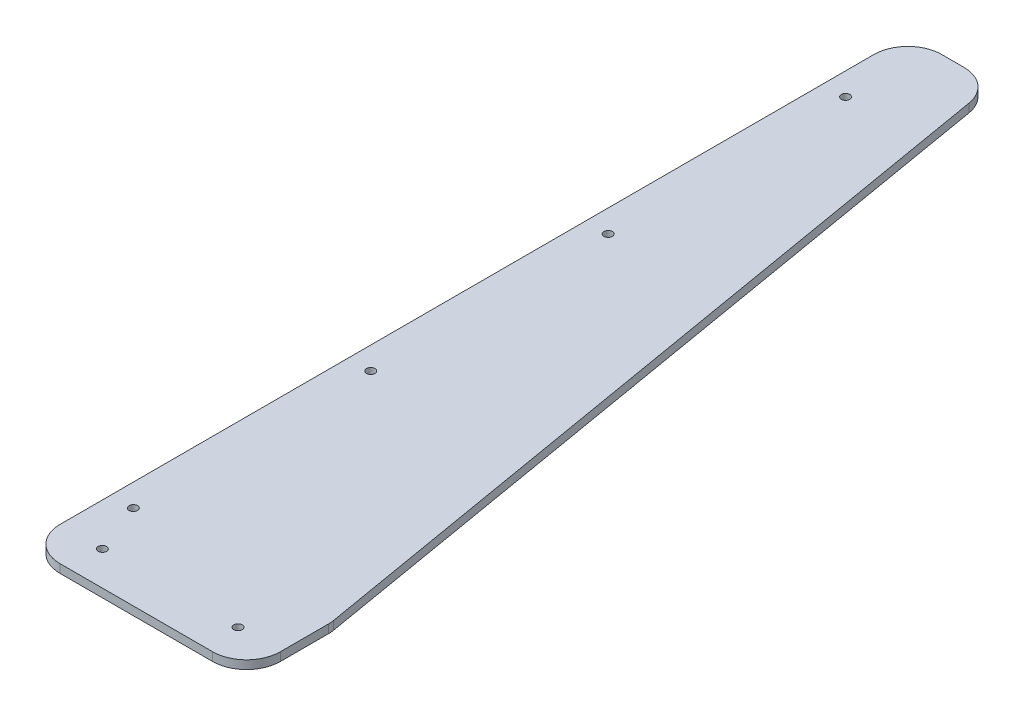
ISO-10303-21;
HEADER;
FILE_DESCRIPTION(('STEP AP214'),'2;1');
FILE_NAME('part.step','',(''),(''),'','','');
FILE_SCHEMA(('AUTOMOTIVE_DESIGN { 1 0 10303 214 1 1 1 1 }'));
ENDSEC;
DATA;
#1=APPLICATION_CONTEXT('core data for automotive mechanical design processes');
#2=APPLICATION_PROTOCOL_DEFINITION('international standard','automotive_design',2000,#1);
#3=PRODUCT_CONTEXT('',#1,'mechanical');
#4=PRODUCT('Part','Part','',(#3));
#5=PRODUCT_RELATED_PRODUCT_CATEGORY('part','',(#4));
#6=PRODUCT_DEFINITION_FORMATION('','',#4);
#7=PRODUCT_DEFINITION_CONTEXT('part definition',#1,'design');
#8=PRODUCT_DEFINITION('design','',#6,#7);
#9=PRODUCT_DEFINITION_SHAPE('','',#8);
#10=(LENGTH_UNIT() NAMED_UNIT(*) SI_UNIT(.MILLI.,.METRE.));
#11=(NAMED_UNIT(*) PLANE_ANGLE_UNIT() SI_UNIT($,.RADIAN.));
#12=(NAMED_UNIT(*) SI_UNIT($,.STERADIAN.) SOLID_ANGLE_UNIT());
#13=UNCERTAINTY_MEASURE_WITH_UNIT(LENGTH_MEASURE(1.E-05),#10,'distance_accuracy_value','');
#14=(GEOMETRIC_REPRESENTATION_CONTEXT(3) GLOBAL_UNCERTAINTY_ASSIGNED_CONTEXT((#13)) GLOBAL_UNIT_ASSIGNED_CONTEXT((#10,
#11,#12)) REPRESENTATION_CONTEXT('',''));
#15=CARTESIAN_POINT('',(0.,0.,0.));
#16=DIRECTION('',(0.,0.,1.));
#17=DIRECTION('',(1.,0.,0.));
#18=AXIS2_PLACEMENT_3D('',#15,#16,#17);
#19=CARTESIAN_POINT('',(0.,3.175,0.));
#20=DIRECTION('',(1.,0.,0.));
#21=DIRECTION('',(0.,0.,-1.));
#22=AXIS2_PLACEMENT_3D('',#19,#20,#21);
#23=PLANE('',#22);
#24=DIRECTION('',(0.,0.,1.));
#25=VECTOR('',#24,1.);
#26=CARTESIAN_POINT('',(0.,0.,0.));
#27=LINE('',#26,#25);
#28=CARTESIAN_POINT('',(0.,0.,-317.5));
#29=VERTEX_POINT('',#28);
#30=CARTESIAN_POINT('',(0.,0.,-12.7));
#31=VERTEX_POINT('',#30);
#32=EDGE_CURVE('E137',#29,#31,#27,.T.);
#33=ORIENTED_EDGE('',*,*,#32,.T.);
#34=DIRECTION('',(0.,-1.,0.));
#35=VECTOR('',#34,1.);
#36=CARTESIAN_POINT('',(0.,3.175,-12.7));
#37=LINE('',#36,#35);
#38=CARTESIAN_POINT('',(0.,3.175,-12.7));
#39=VERTEX_POINT('',#38);
#40=EDGE_CURVE('E115',#31,#39,#37,.F.);
#41=ORIENTED_EDGE('',*,*,#40,.T.);
#42=DIRECTION('',(0.,0.,1.));
#43=VECTOR('',#42,1.);
#44=CARTESIAN_POINT('',(0.,3.175,0.));
#45=LINE('',#44,#43);
#46=CARTESIAN_POINT('',(0.,3.175,-317.5));
#47=VERTEX_POINT('',#46);
#48=EDGE_CURVE('E150',#47,#39,#45,.T.);
#49=ORIENTED_EDGE('',*,*,#48,.F.);
#50=DIRECTION('',(0.,-1.,0.));
#51=VECTOR('',#50,1.);
#52=CARTESIAN_POINT('',(0.,3.175,-317.5));
#53=LINE('',#52,#51);
#54=EDGE_CURVE('E120',#47,#29,#53,.T.);
#55=ORIENTED_EDGE('',*,*,#54,.T.);
#56=EDGE_LOOP('',(#33,#41,#49,#55));
#57=FACE_BOUND('',#56,.T.);
#58=ADVANCED_FACE('F33',(#57),#23,.F.);
#59=CARTESIAN_POINT('',(31.75,3.175,0.));
#60=DIRECTION('',(0.,0.,-1.));
#61=DIRECTION('',(-1.,0.,0.));
#62=AXIS2_PLACEMENT_3D('',#59,#60,#61);
#63=PLANE('',#62);
#64=DIRECTION('',(1.,0.,0.));
#65=VECTOR('',#64,1.);
#66=CARTESIAN_POINT('',(0.,3.175,0.));
#67=LINE('',#66,#65);
#68=CARTESIAN_POINT('',(12.7,3.175,0.));
#69=VERTEX_POINT('',#68);
#70=CARTESIAN_POINT('',(69.85,3.175,0.));
#71=VERTEX_POINT('',#70);
#72=EDGE_CURVE('E130',#69,#71,#67,.T.);
#73=ORIENTED_EDGE('',*,*,#72,.F.);
#74=DIRECTION('',(0.,-1.,0.));
#75=VECTOR('',#74,1.);
#76=CARTESIAN_POINT('',(12.7,3.175,0.));
#77=LINE('',#76,#75);
#78=CARTESIAN_POINT('',(12.7,0.,0.));
#79=VERTEX_POINT('',#78);
#80=EDGE_CURVE('E114',#69,#79,#77,.T.);
#81=ORIENTED_EDGE('',*,*,#80,.T.);
#82=DIRECTION('',(1.,0.,0.));
#83=VECTOR('',#82,1.);
#84=CARTESIAN_POINT('',(31.75,0.,0.));
#85=LINE('',#84,#83);
#86=CARTESIAN_POINT('',(69.85,0.,0.));
#87=VERTEX_POINT('',#86);
#88=EDGE_CURVE('E127',#79,#87,#85,.T.);
#89=ORIENTED_EDGE('',*,*,#88,.T.);
#90=DIRECTION('',(0.,-1.,0.));
#91=VECTOR('',#90,1.);
#92=CARTESIAN_POINT('',(69.85,3.175,0.));
#93=LINE('',#92,#91);
#94=EDGE_CURVE('E132',#87,#71,#93,.F.);
#95=ORIENTED_EDGE('',*,*,#94,.T.);
#96=EDGE_LOOP('',(#73,#81,#89,#95));
#97=FACE_BOUND('',#96,.T.);
#98=ADVANCED_FACE('F126',(#97),#63,.F.);
#99=CARTESIAN_POINT('',(82.55,3.175,0.));
#100=DIRECTION('',(-1.,0.,0.));
#101=DIRECTION('',(0.,0.,1.));
#102=AXIS2_PLACEMENT_3D('',#99,#100,#101);
#103=PLANE('',#102);
#104=DIRECTION('',(0.,0.,-1.));
#105=VECTOR('',#104,1.);
#106=CARTESIAN_POINT('',(82.55,3.175,0.));
#107=LINE('',#106,#105);
#108=CARTESIAN_POINT('',(82.55,3.175,-12.7));
#109=VERTEX_POINT('',#108);
#110=CARTESIAN_POINT('',(82.55,3.175,-30.6768662492677));
#111=VERTEX_POINT('',#110);
#112=EDGE_CURVE('E194',#109,#111,#107,.T.);
#113=ORIENTED_EDGE('',*,*,#112,.F.);
#114=DIRECTION('',(0.,-1.,0.));
#115=VECTOR('',#114,1.);
#116=CARTESIAN_POINT('',(82.55,3.175,-12.7));
#117=LINE('',#116,#115);
#118=CARTESIAN_POINT('',(82.55,0.,-12.7));
#119=VERTEX_POINT('',#118);
#120=EDGE_CURVE('E173',#109,#119,#117,.T.);
#121=ORIENTED_EDGE('',*,*,#120,.T.);
#122=DIRECTION('',(0.,0.,-1.));
#123=VECTOR('',#122,1.);
#124=CARTESIAN_POINT('',(82.55,0.,0.));
#125=LINE('',#124,#123);
#126=CARTESIAN_POINT('',(82.55,0.,-30.6768662492677));
#127=VERTEX_POINT('',#126);
#128=EDGE_CURVE('E136',#119,#127,#125,.T.);
#129=ORIENTED_EDGE('',*,*,#128,.T.);
#130=DIRECTION('',(0.,-1.,0.));
#131=VECTOR('',#130,1.);
#132=CARTESIAN_POINT('',(82.55,3.175,-30.6768662492677));
#133=LINE('',#132,#131);
#134=EDGE_CURVE('E171',#127,#111,#133,.F.);
#135=ORIENTED_EDGE('',*,*,#134,.T.);
#136=EDGE_LOOP('',(#113,#121,#129,#135));
#137=FACE_BOUND('',#136,.T.);
#138=ADVANCED_FACE('F222',(#137),#103,.F.);
#139=CARTESIAN_POINT('',(31.75,3.175,-330.2));
#140=DIRECTION('',(-0.985821169784127,0.,0.167799348048362));
#141=DIRECTION('',(0.167799348048362,0.,0.985821169784127));
#142=AXIS2_PLACEMENT_3D('',#139,#140,#141);
#143=PLANE('',#142);
#144=DIRECTION('',(-0.167799348048362,0.,-0.985821169784127));
#145=VECTOR('',#144,1.);
#146=CARTESIAN_POINT('',(31.75,3.175,-330.2));
#147=LINE('',#146,#145);
#148=CARTESIAN_POINT('',(82.3699288562584,3.175,-32.8079179694818));
#149=VERTEX_POINT('',#148);
#150=CARTESIAN_POINT('',(33.5489699199635,3.175,-319.631051720214));
#151=VERTEX_POINT('',#150);
#152=EDGE_CURVE('E201',#149,#151,#147,.T.);
#153=ORIENTED_EDGE('',*,*,#152,.F.);
#154=DIRECTION('',(0.,-1.,0.));
#155=VECTOR('',#154,1.);
#156=CARTESIAN_POINT('',(82.3699288562584,3.175,-32.807917969482));
#157=LINE('',#156,#155);
#158=CARTESIAN_POINT('',(82.3699288562584,0.,-32.8079179694818));
#159=VERTEX_POINT('',#158);
#160=EDGE_CURVE('E178',#149,#159,#157,.T.);
#161=ORIENTED_EDGE('',*,*,#160,.T.);
#162=DIRECTION('',(-0.167799348048362,0.,-0.985821169784127));
#163=VECTOR('',#162,1.);
#164=CARTESIAN_POINT('',(31.75,0.,-330.2));
#165=LINE('',#164,#163);
#166=CARTESIAN_POINT('',(33.5489699199635,0.,-319.631051720214));
#167=VERTEX_POINT('',#166);
#168=EDGE_CURVE('E140',#159,#167,#165,.T.);
#169=ORIENTED_EDGE('',*,*,#168,.T.);
#170=DIRECTION('',(0.,-1.,0.));
#171=VECTOR('',#170,1.);
#172=CARTESIAN_POINT('',(33.5489699199635,3.175,-319.631051720214));
#173=LINE('',#172,#171);
#174=EDGE_CURVE('E176',#167,#151,#173,.F.);
#175=ORIENTED_EDGE('',*,*,#174,.T.);
#176=EDGE_LOOP('',(#153,#161,#169,#175));
#177=FACE_BOUND('',#176,.T.);
#178=ADVANCED_FACE('F212',(#177),#143,.F.);
#179=CARTESIAN_POINT('',(0.,3.175,-330.2));
#180=DIRECTION('',(0.,0.,1.));
#181=DIRECTION('',(1.,0.,0.));
#182=AXIS2_PLACEMENT_3D('',#179,#180,#181);
#183=PLANE('',#182);
#184=DIRECTION('',(-1.,0.,0.));
#185=VECTOR('',#184,1.);
#186=CARTESIAN_POINT('',(0.,0.,-330.2));
#187=LINE('',#186,#185);
#188=CARTESIAN_POINT('',(21.0290410637051,0.,-330.2));
#189=VERTEX_POINT('',#188);
#190=CARTESIAN_POINT('',(12.7,0.,-330.2));
#191=VERTEX_POINT('',#190);
#192=EDGE_CURVE('E148',#189,#191,#187,.T.);
#193=ORIENTED_EDGE('',*,*,#192,.T.);
#194=DIRECTION('',(0.,-1.,0.));
#195=VECTOR('',#194,1.);
#196=CARTESIAN_POINT('',(12.7,3.175,-330.2));
#197=LINE('',#196,#195);
#198=CARTESIAN_POINT('',(12.7,3.175,-330.2));
#199=VERTEX_POINT('',#198);
#200=EDGE_CURVE('E11',#191,#199,#197,.F.);
#201=ORIENTED_EDGE('',*,*,#200,.T.);
#202=DIRECTION('',(-1.,0.,0.));
#203=VECTOR('',#202,1.);
#204=CARTESIAN_POINT('',(0.,3.175,-330.2));
#205=LINE('',#204,#203);
#206=CARTESIAN_POINT('',(21.0290410637051,3.175,-330.2));
#207=VERTEX_POINT('',#206);
#208=EDGE_CURVE('E151',#207,#199,#205,.T.);
#209=ORIENTED_EDGE('',*,*,#208,.F.);
#210=DIRECTION('',(0.,-1.,0.));
#211=VECTOR('',#210,1.);
#212=CARTESIAN_POINT('',(21.0290410637051,3.175,-330.2));
#213=LINE('',#212,#211);
#214=EDGE_CURVE('E41',#207,#189,#213,.T.);
#215=ORIENTED_EDGE('',*,*,#214,.T.);
#216=EDGE_LOOP('',(#193,#201,#209,#215));
#217=FACE_BOUND('',#216,.T.);
#218=ADVANCED_FACE('F183',(#217),#183,.F.);
#219=CARTESIAN_POINT('',(0.,3.175,0.));
#220=DIRECTION('',(0.,-1.,0.));
#221=DIRECTION('',(0.,0.,-1.));
#222=AXIS2_PLACEMENT_3D('',#219,#220,#221);
#223=PLANE('',#222);
#224=CARTESIAN_POINT('',(8.43279999999994,3.175,-298.45));
#225=DIRECTION('',(0.,-1.,0.));
#226=DIRECTION('',(0.,0.,-1.));
#227=AXIS2_PLACEMENT_3D('',#224,#225,#226);
#228=CIRCLE('',#227,1.5875);
#229=CARTESIAN_POINT('',(8.43279999999994,3.175,-300.0375));
#230=VERTEX_POINT('',#229);
#231=EDGE_CURVE('E363',#230,#230,#228,.T.);
#232=ORIENTED_EDGE('',*,*,#231,.T.);
#233=EDGE_LOOP('',(#232));
#234=FACE_BOUND('',#233,.T.);
#235=CARTESIAN_POINT('',(8.43279999999994,3.175,-209.55));
#236=DIRECTION('',(0.,-1.,0.));
#237=DIRECTION('',(0.,0.,-1.));
#238=AXIS2_PLACEMENT_3D('',#235,#236,#237);
#239=CIRCLE('',#238,1.5875);
#240=CARTESIAN_POINT('',(8.43279999999994,3.175,-211.1375));
#241=VERTEX_POINT('',#240);
#242=EDGE_CURVE('E373',#241,#241,#239,.T.);
#243=ORIENTED_EDGE('',*,*,#242,.T.);
#244=EDGE_LOOP('',(#243));
#245=FACE_BOUND('',#244,.T.);
#246=CARTESIAN_POINT('',(8.43279999999994,3.175,-120.65));
#247=DIRECTION('',(0.,-1.,0.));
#248=DIRECTION('',(0.,0.,-1.));
#249=AXIS2_PLACEMENT_3D('',#246,#247,#248);
#250=CIRCLE('',#249,1.5875);
#251=CARTESIAN_POINT('',(8.43279999999994,3.175,-122.2375));
#252=VERTEX_POINT('',#251);
#253=EDGE_CURVE('E379',#252,#252,#250,.T.);
#254=ORIENTED_EDGE('',*,*,#253,.T.);
#255=EDGE_LOOP('',(#254));
#256=FACE_BOUND('',#255,.T.);
#257=CARTESIAN_POINT('',(8.43279999999998,3.175,-31.75));
#258=DIRECTION('',(0.,-1.,0.));
#259=DIRECTION('',(0.,0.,-1.));
#260=AXIS2_PLACEMENT_3D('',#257,#258,#259);
#261=CIRCLE('',#260,1.5875);
#262=CARTESIAN_POINT('',(8.43279999999998,3.175,-33.3375));
#263=VERTEX_POINT('',#262);
#264=EDGE_CURVE('E385',#263,#263,#261,.T.);
#265=ORIENTED_EDGE('',*,*,#264,.T.);
#266=EDGE_LOOP('',(#265));
#267=FACE_BOUND('',#266,.T.);
#268=CARTESIAN_POINT('',(66.675,3.175,-12.7));
#269=DIRECTION('',(0.,-1.,0.));
#270=DIRECTION('',(0.,0.,-1.));
#271=AXIS2_PLACEMENT_3D('',#268,#269,#270);
#272=CIRCLE('',#271,1.58749999999999);
#273=CARTESIAN_POINT('',(66.675,3.175,-14.2875));
#274=VERTEX_POINT('',#273);
#275=EDGE_CURVE('E391',#274,#274,#272,.T.);
#276=ORIENTED_EDGE('',*,*,#275,.T.);
#277=EDGE_LOOP('',(#276));
#278=FACE_BOUND('',#277,.T.);
#279=CARTESIAN_POINT('',(15.875,3.175,-12.7));
#280=DIRECTION('',(0.,-1.,0.));
#281=DIRECTION('',(0.,0.,-1.));
#282=AXIS2_PLACEMENT_3D('',#279,#280,#281);
#283=CIRCLE('',#282,1.5875);
#284=CARTESIAN_POINT('',(15.875,3.175,-14.2875));
#285=VERTEX_POINT('',#284);
#286=EDGE_CURVE('E142',#285,#285,#283,.T.);
#287=ORIENTED_EDGE('',*,*,#286,.T.);
#288=EDGE_LOOP('',(#287));
#289=FACE_BOUND('',#288,.T.);
#290=ORIENTED_EDGE('',*,*,#48,.T.);
#291=CARTESIAN_POINT('',(12.7,3.175,-12.7));
#292=DIRECTION('',(0.,-1.,0.));
#293=DIRECTION('',(0.,0.,-1.));
#294=AXIS2_PLACEMENT_3D('',#291,#292,#293);
#295=CIRCLE('',#294,12.7);
#296=EDGE_CURVE('E169',#39,#69,#295,.F.);
#297=ORIENTED_EDGE('',*,*,#296,.T.);
#298=ORIENTED_EDGE('',*,*,#72,.T.);
#299=CARTESIAN_POINT('',(69.85,3.175,-12.7));
#300=DIRECTION('',(0.,-1.,0.));
#301=DIRECTION('',(0.,0.,-1.));
#302=AXIS2_PLACEMENT_3D('',#299,#300,#301);
#303=CIRCLE('',#302,12.7);
#304=EDGE_CURVE('E167',#71,#109,#303,.F.);
#305=ORIENTED_EDGE('',*,*,#304,.T.);
#306=ORIENTED_EDGE('',*,*,#112,.T.);
#307=CARTESIAN_POINT('',(69.85,3.175,-30.6768662492677));
#308=DIRECTION('',(0.,-1.,0.));
#309=DIRECTION('',(0.,0.,-1.));
#310=AXIS2_PLACEMENT_3D('',#307,#308,#309);
#311=CIRCLE('',#310,12.7);
#312=EDGE_CURVE('E165',#111,#149,#311,.F.);
#313=ORIENTED_EDGE('',*,*,#312,.T.);
#314=ORIENTED_EDGE('',*,*,#152,.T.);
#315=CARTESIAN_POINT('',(21.0290410637051,3.175,-317.5));
#316=DIRECTION('',(0.,-1.,0.));
#317=DIRECTION('',(0.,0.,-1.));
#318=AXIS2_PLACEMENT_3D('',#315,#316,#317);
#319=CIRCLE('',#318,12.7);
#320=EDGE_CURVE('E53',#151,#207,#319,.F.);
#321=ORIENTED_EDGE('',*,*,#320,.T.);
#322=ORIENTED_EDGE('',*,*,#208,.T.);
#323=CARTESIAN_POINT('',(12.7,3.175,-317.5));
#324=DIRECTION('',(0.,-1.,0.));
#325=DIRECTION('',(0.,0.,-1.));
#326=AXIS2_PLACEMENT_3D('',#323,#324,#325);
#327=CIRCLE('',#326,12.7);
#328=EDGE_CURVE('E163',#199,#47,#327,.F.);
#329=ORIENTED_EDGE('',*,*,#328,.T.);
#330=EDGE_LOOP('',(#290,#297,#298,#305,#306,#313,#314,#321,#322,#329));
#331=FACE_BOUND('',#330,.T.);
#332=ADVANCED_FACE('F202',(#234,#245,#256,#267,#278,#289,#331),#223,.F.);
#333=CARTESIAN_POINT('',(0.,0.,0.));
#334=DIRECTION('',(0.,-1.,0.));
#335=DIRECTION('',(0.,0.,-1.));
#336=AXIS2_PLACEMENT_3D('',#333,#334,#335);
#337=PLANE('',#336);
#338=CARTESIAN_POINT('',(8.43279999999994,0.,-298.45));
#339=DIRECTION('',(0.,-1.,0.));
#340=DIRECTION('',(0.,0.,-1.));
#341=AXIS2_PLACEMENT_3D('',#338,#339,#340);
#342=CIRCLE('',#341,1.58749999999999);
#343=CARTESIAN_POINT('',(8.43279999999994,0.,-300.0375));
#344=VERTEX_POINT('',#343);
#345=EDGE_CURVE('E366',#344,#344,#342,.T.);
#346=ORIENTED_EDGE('',*,*,#345,.F.);
#347=EDGE_LOOP('',(#346));
#348=FACE_BOUND('',#347,.T.);
#349=CARTESIAN_POINT('',(8.43279999999994,0.,-209.55));
#350=DIRECTION('',(0.,-1.,0.));
#351=DIRECTION('',(0.,0.,-1.));
#352=AXIS2_PLACEMENT_3D('',#349,#350,#351);
#353=CIRCLE('',#352,1.58749999999999);
#354=CARTESIAN_POINT('',(8.43279999999994,0.,-211.1375));
#355=VERTEX_POINT('',#354);
#356=EDGE_CURVE('E368',#355,#355,#353,.T.);
#357=ORIENTED_EDGE('',*,*,#356,.F.);
#358=EDGE_LOOP('',(#357));
#359=FACE_BOUND('',#358,.T.);
#360=CARTESIAN_POINT('',(8.43279999999994,0.,-120.65));
#361=DIRECTION('',(0.,-1.,0.));
#362=DIRECTION('',(0.,0.,-1.));
#363=AXIS2_PLACEMENT_3D('',#360,#361,#362);
#364=CIRCLE('',#363,1.58749999999999);
#365=CARTESIAN_POINT('',(8.43279999999994,0.,-122.2375));
#366=VERTEX_POINT('',#365);
#367=EDGE_CURVE('E376',#366,#366,#364,.T.);
#368=ORIENTED_EDGE('',*,*,#367,.F.);
#369=EDGE_LOOP('',(#368));
#370=FACE_BOUND('',#369,.T.);
#371=CARTESIAN_POINT('',(8.43279999999998,0.,-31.75));
#372=DIRECTION('',(0.,-1.,0.));
#373=DIRECTION('',(0.,0.,-1.));
#374=AXIS2_PLACEMENT_3D('',#371,#372,#373);
#375=CIRCLE('',#374,1.58749999999999);
#376=CARTESIAN_POINT('',(8.43279999999998,0.,-33.3375));
#377=VERTEX_POINT('',#376);
#378=EDGE_CURVE('E382',#377,#377,#375,.T.);
#379=ORIENTED_EDGE('',*,*,#378,.F.);
#380=EDGE_LOOP('',(#379));
#381=FACE_BOUND('',#380,.T.);
#382=CARTESIAN_POINT('',(66.675,0.,-12.7));
#383=DIRECTION('',(0.,-1.,0.));
#384=DIRECTION('',(0.,0.,-1.));
#385=AXIS2_PLACEMENT_3D('',#382,#383,#384);
#386=CIRCLE('',#385,1.58749999999999);
#387=CARTESIAN_POINT('',(66.675,0.,-14.2875));
#388=VERTEX_POINT('',#387);
#389=EDGE_CURVE('E388',#388,#388,#386,.T.);
#390=ORIENTED_EDGE('',*,*,#389,.F.);
#391=EDGE_LOOP('',(#390));
#392=FACE_BOUND('',#391,.T.);
#393=CARTESIAN_POINT('',(15.875,0.,-12.7));
#394=DIRECTION('',(0.,-1.,0.));
#395=DIRECTION('',(0.,0.,-1.));
#396=AXIS2_PLACEMENT_3D('',#393,#394,#395);
#397=CIRCLE('',#396,1.58749999999999);
#398=CARTESIAN_POINT('',(15.875,0.,-14.2875));
#399=VERTEX_POINT('',#398);
#400=EDGE_CURVE('E393',#399,#399,#397,.T.);
#401=ORIENTED_EDGE('',*,*,#400,.F.);
#402=EDGE_LOOP('',(#401));
#403=FACE_BOUND('',#402,.T.);
#404=ORIENTED_EDGE('',*,*,#88,.F.);
#405=CARTESIAN_POINT('',(12.7,0.,-12.7));
#406=DIRECTION('',(0.,-1.,0.));
#407=DIRECTION('',(0.,0.,-1.));
#408=AXIS2_PLACEMENT_3D('',#405,#406,#407);
#409=CIRCLE('',#408,12.7);
#410=EDGE_CURVE('E110',#79,#31,#409,.T.);
#411=ORIENTED_EDGE('',*,*,#410,.T.);
#412=ORIENTED_EDGE('',*,*,#32,.F.);
#413=CARTESIAN_POINT('',(12.7,0.,-317.5));
#414=DIRECTION('',(0.,-1.,0.));
#415=DIRECTION('',(0.,0.,-1.));
#416=AXIS2_PLACEMENT_3D('',#413,#414,#415);
#417=CIRCLE('',#416,12.7);
#418=EDGE_CURVE('E154',#29,#191,#417,.T.);
#419=ORIENTED_EDGE('',*,*,#418,.T.);
#420=ORIENTED_EDGE('',*,*,#192,.F.);
#421=CARTESIAN_POINT('',(21.0290410637051,0.,-317.5));
#422=DIRECTION('',(0.,-1.,0.));
#423=DIRECTION('',(0.,0.,-1.));
#424=AXIS2_PLACEMENT_3D('',#421,#422,#423);
#425=CIRCLE('',#424,12.7);
#426=EDGE_CURVE('E131',#189,#167,#425,.T.);
#427=ORIENTED_EDGE('',*,*,#426,.T.);
#428=ORIENTED_EDGE('',*,*,#168,.F.);
#429=CARTESIAN_POINT('',(69.85,0.,-30.6768662492677));
#430=DIRECTION('',(0.,-1.,0.));
#431=DIRECTION('',(0.,0.,-1.));
#432=AXIS2_PLACEMENT_3D('',#429,#430,#431);
#433=CIRCLE('',#432,12.7);
#434=EDGE_CURVE('E156',#159,#127,#433,.T.);
#435=ORIENTED_EDGE('',*,*,#434,.T.);
#436=ORIENTED_EDGE('',*,*,#128,.F.);
#437=CARTESIAN_POINT('',(69.85,0.,-12.7));
#438=DIRECTION('',(0.,-1.,0.));
#439=DIRECTION('',(0.,0.,-1.));
#440=AXIS2_PLACEMENT_3D('',#437,#438,#439);
#441=CIRCLE('',#440,12.7);
#442=EDGE_CURVE('E121',#119,#87,#441,.T.);
#443=ORIENTED_EDGE('',*,*,#442,.T.);
#444=EDGE_LOOP('',(#404,#411,#412,#419,#420,#427,#428,#435,#436,#443));
#445=FACE_BOUND('',#444,.T.);
#446=ADVANCED_FACE('F134',(#348,#359,#370,#381,#392,#403,#445),#337,.T.);
#447=CARTESIAN_POINT('',(12.7,3.175,-12.7));
#448=DIRECTION('',(0.,-1.,0.));
#449=DIRECTION('',(0.,0.,-1.));
#450=AXIS2_PLACEMENT_3D('',#447,#448,#449);
#451=CYLINDRICAL_SURFACE('',#450,12.7);
#452=ORIENTED_EDGE('',*,*,#296,.F.);
#453=ORIENTED_EDGE('',*,*,#40,.F.);
#454=ORIENTED_EDGE('',*,*,#410,.F.);
#455=ORIENTED_EDGE('',*,*,#80,.F.);
#456=EDGE_LOOP('',(#452,#453,#454,#455));
#457=FACE_BOUND('',#456,.T.);
#458=ADVANCED_FACE('F113',(#457),#451,.T.);
#459=CARTESIAN_POINT('',(69.85,3.175,-12.7));
#460=DIRECTION('',(0.,-1.,0.));
#461=DIRECTION('',(0.,0.,-1.));
#462=AXIS2_PLACEMENT_3D('',#459,#460,#461);
#463=CYLINDRICAL_SURFACE('',#462,12.7);
#464=ORIENTED_EDGE('',*,*,#304,.F.);
#465=ORIENTED_EDGE('',*,*,#94,.F.);
#466=ORIENTED_EDGE('',*,*,#442,.F.);
#467=ORIENTED_EDGE('',*,*,#120,.F.);
#468=EDGE_LOOP('',(#464,#465,#466,#467));
#469=FACE_BOUND('',#468,.T.);
#470=ADVANCED_FACE('F228',(#469),#463,.T.);
#471=CARTESIAN_POINT('',(69.85,3.175,-30.6768662492677));
#472=DIRECTION('',(0.,-1.,0.));
#473=DIRECTION('',(0.,0.,-1.));
#474=AXIS2_PLACEMENT_3D('',#471,#472,#473);
#475=CYLINDRICAL_SURFACE('',#474,12.7);
#476=ORIENTED_EDGE('',*,*,#312,.F.);
#477=ORIENTED_EDGE('',*,*,#134,.F.);
#478=ORIENTED_EDGE('',*,*,#434,.F.);
#479=ORIENTED_EDGE('',*,*,#160,.F.);
#480=EDGE_LOOP('',(#476,#477,#478,#479));
#481=FACE_BOUND('',#480,.T.);
#482=ADVANCED_FACE('F231',(#481),#475,.T.);
#483=CARTESIAN_POINT('',(12.7,3.175,-317.5));
#484=DIRECTION('',(0.,-1.,0.));
#485=DIRECTION('',(0.,0.,-1.));
#486=AXIS2_PLACEMENT_3D('',#483,#484,#485);
#487=CYLINDRICAL_SURFACE('',#486,12.7);
#488=ORIENTED_EDGE('',*,*,#328,.F.);
#489=ORIENTED_EDGE('',*,*,#200,.F.);
#490=ORIENTED_EDGE('',*,*,#418,.F.);
#491=ORIENTED_EDGE('',*,*,#54,.F.);
#492=EDGE_LOOP('',(#488,#489,#490,#491));
#493=FACE_BOUND('',#492,.T.);
#494=ADVANCED_FACE('F189',(#493),#487,.T.);
#495=CARTESIAN_POINT('',(21.0290410637051,3.175,-317.5));
#496=DIRECTION('',(0.,-1.,0.));
#497=DIRECTION('',(0.,0.,-1.));
#498=AXIS2_PLACEMENT_3D('',#495,#496,#497);
#499=CYLINDRICAL_SURFACE('',#498,12.7);
#500=ORIENTED_EDGE('',*,*,#320,.F.);
#501=ORIENTED_EDGE('',*,*,#174,.F.);
#502=ORIENTED_EDGE('',*,*,#426,.F.);
#503=ORIENTED_EDGE('',*,*,#214,.F.);
#504=EDGE_LOOP('',(#500,#501,#502,#503));
#505=FACE_BOUND('',#504,.T.);
#506=ADVANCED_FACE('F35',(#505),#499,.T.);
#507=CARTESIAN_POINT('',(15.875,0.,-12.7));
#508=DIRECTION('',(0.,-1.,0.));
#509=DIRECTION('',(0.,0.,-1.));
#510=AXIS2_PLACEMENT_3D('',#507,#508,#509);
#511=CYLINDRICAL_SURFACE('',#510,1.58749999999999);
#512=ORIENTED_EDGE('',*,*,#286,.F.);
#513=EDGE_LOOP('',(#512));
#514=FACE_BOUND('',#513,.T.);
#515=ORIENTED_EDGE('',*,*,#400,.T.);
#516=EDGE_LOOP('',(#515));
#517=FACE_BOUND('',#516,.T.);
#518=ADVANCED_FACE('F239',(#514,#517),#511,.F.);
#519=CARTESIAN_POINT('',(66.675,0.,-12.7));
#520=DIRECTION('',(0.,-1.,0.));
#521=DIRECTION('',(0.,0.,-1.));
#522=AXIS2_PLACEMENT_3D('',#519,#520,#521);
#523=CYLINDRICAL_SURFACE('',#522,1.58749999999999);
#524=ORIENTED_EDGE('',*,*,#275,.F.);
#525=EDGE_LOOP('',(#524));
#526=FACE_BOUND('',#525,.T.);
#527=ORIENTED_EDGE('',*,*,#389,.T.);
#528=EDGE_LOOP('',(#527));
#529=FACE_BOUND('',#528,.T.);
#530=ADVANCED_FACE('F243',(#526,#529),#523,.F.);
#531=CARTESIAN_POINT('',(8.43279999999998,0.,-31.75));
#532=DIRECTION('',(0.,-1.,0.));
#533=DIRECTION('',(0.,0.,-1.));
#534=AXIS2_PLACEMENT_3D('',#531,#532,#533);
#535=CYLINDRICAL_SURFACE('',#534,1.58749999999999);
#536=ORIENTED_EDGE('',*,*,#264,.F.);
#537=EDGE_LOOP('',(#536));
#538=FACE_BOUND('',#537,.T.);
#539=ORIENTED_EDGE('',*,*,#378,.T.);
#540=EDGE_LOOP('',(#539));
#541=FACE_BOUND('',#540,.T.);
#542=ADVANCED_FACE('F317',(#538,#541),#535,.F.);
#543=CARTESIAN_POINT('',(8.43279999999994,0.,-120.65));
#544=DIRECTION('',(0.,-1.,0.));
#545=DIRECTION('',(0.,0.,-1.));
#546=AXIS2_PLACEMENT_3D('',#543,#544,#545);
#547=CYLINDRICAL_SURFACE('',#546,1.58749999999999);
#548=ORIENTED_EDGE('',*,*,#253,.F.);
#549=EDGE_LOOP('',(#548));
#550=FACE_BOUND('',#549,.T.);
#551=ORIENTED_EDGE('',*,*,#367,.T.);
#552=EDGE_LOOP('',(#551));
#553=FACE_BOUND('',#552,.T.);
#554=ADVANCED_FACE('F327',(#550,#553),#547,.F.);
#555=CARTESIAN_POINT('',(8.43279999999994,0.,-209.55));
#556=DIRECTION('',(0.,-1.,0.));
#557=DIRECTION('',(0.,0.,-1.));
#558=AXIS2_PLACEMENT_3D('',#555,#556,#557);
#559=CYLINDRICAL_SURFACE('',#558,1.58749999999999);
#560=ORIENTED_EDGE('',*,*,#242,.F.);
#561=EDGE_LOOP('',(#560));
#562=FACE_BOUND('',#561,.T.);
#563=ORIENTED_EDGE('',*,*,#356,.T.);
#564=EDGE_LOOP('',(#563));
#565=FACE_BOUND('',#564,.T.);
#566=ADVANCED_FACE('F337',(#562,#565),#559,.F.);
#567=CARTESIAN_POINT('',(8.43279999999994,0.,-298.45));
#568=DIRECTION('',(0.,-1.,0.));
#569=DIRECTION('',(0.,0.,-1.));
#570=AXIS2_PLACEMENT_3D('',#567,#568,#569);
#571=CYLINDRICAL_SURFACE('',#570,1.58749999999999);
#572=ORIENTED_EDGE('',*,*,#231,.F.);
#573=EDGE_LOOP('',(#572));
#574=FACE_BOUND('',#573,.T.);
#575=ORIENTED_EDGE('',*,*,#345,.T.);
#576=EDGE_LOOP('',(#575));
#577=FACE_BOUND('',#576,.T.);
#578=ADVANCED_FACE('F347',(#574,#577),#571,.F.);
#579=CLOSED_SHELL('',(#58,#98,#138,#178,#218,#332,#446,#458,#470,#482,#494,#506,#518,#530,#542,
#554,#566,#578));
#580=MANIFOLD_SOLID_BREP('B2',#579);
#581=ADVANCED_BREP_SHAPE_REPRESENTATION('',(#18,#580),#14);
#582=SHAPE_DEFINITION_REPRESENTATION(#9,#581);
ENDSEC;
END-ISO-10303-21;
